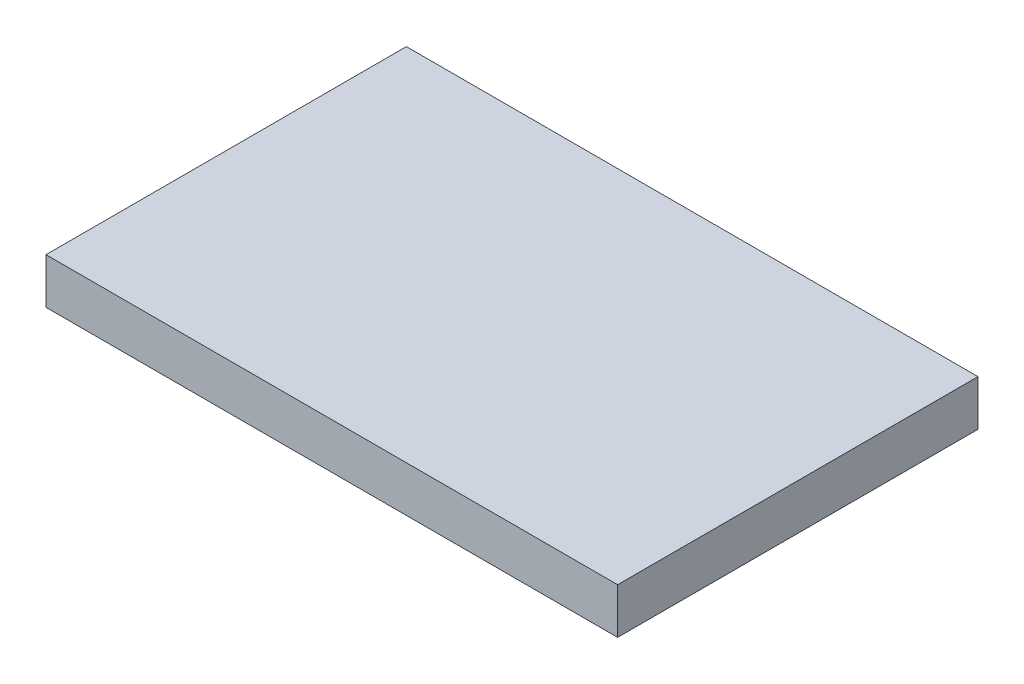
ISO-10303-21;
HEADER;
FILE_DESCRIPTION(('STEP AP214'),'2;1');
FILE_NAME('part.step','',(''),(''),'','','');
FILE_SCHEMA(('AUTOMOTIVE_DESIGN { 1 0 10303 214 1 1 1 1 }'));
ENDSEC;
DATA;
#1=APPLICATION_CONTEXT('core data for automotive mechanical design processes');
#2=APPLICATION_PROTOCOL_DEFINITION('international standard','automotive_design',2000,#1);
#3=PRODUCT_CONTEXT('',#1,'mechanical');
#4=PRODUCT('Part','Part','',(#3));
#5=PRODUCT_RELATED_PRODUCT_CATEGORY('part','',(#4));
#6=PRODUCT_DEFINITION_FORMATION('','',#4);
#7=PRODUCT_DEFINITION_CONTEXT('part definition',#1,'design');
#8=PRODUCT_DEFINITION('design','',#6,#7);
#9=PRODUCT_DEFINITION_SHAPE('','',#8);
#10=(LENGTH_UNIT() NAMED_UNIT(*) SI_UNIT(.MILLI.,.METRE.));
#11=(NAMED_UNIT(*) PLANE_ANGLE_UNIT() SI_UNIT($,.RADIAN.));
#12=(NAMED_UNIT(*) SI_UNIT($,.STERADIAN.) SOLID_ANGLE_UNIT());
#13=UNCERTAINTY_MEASURE_WITH_UNIT(LENGTH_MEASURE(1.E-05),#10,'distance_accuracy_value','');
#14=(GEOMETRIC_REPRESENTATION_CONTEXT(3) GLOBAL_UNCERTAINTY_ASSIGNED_CONTEXT((#13)) GLOBAL_UNIT_ASSIGNED_CONTEXT((#10,
#11,#12)) REPRESENTATION_CONTEXT('',''));
#15=CARTESIAN_POINT('',(0.,0.,0.));
#16=DIRECTION('',(0.,0.,1.));
#17=DIRECTION('',(1.,0.,0.));
#18=AXIS2_PLACEMENT_3D('',#15,#16,#17);
#19=CARTESIAN_POINT('',(-6.07499999999999,0.97,3.82999999999999));
#20=DIRECTION('',(1.,0.,0.));
#21=DIRECTION('',(0.,0.,-1.));
#22=AXIS2_PLACEMENT_3D('',#19,#20,#21);
#23=PLANE('',#22);
#24=DIRECTION('',(0.,0.,1.));
#25=VECTOR('',#24,1.);
#26=CARTESIAN_POINT('',(-6.07499999999999,0.,3.82999999999999));
#27=LINE('',#26,#25);
#28=CARTESIAN_POINT('',(-6.07499999999999,0.,-3.83000000000001));
#29=VERTEX_POINT('',#28);
#30=CARTESIAN_POINT('',(-6.07499999999999,0.,3.82999999999999));
#31=VERTEX_POINT('',#30);
#32=EDGE_CURVE('E99',#29,#31,#27,.T.);
#33=ORIENTED_EDGE('',*,*,#32,.T.);
#34=DIRECTION('',(0.,-1.,0.));
#35=VECTOR('',#34,1.);
#36=CARTESIAN_POINT('',(-6.07499999999999,0.97,3.82999999999999));
#37=LINE('',#36,#35);
#38=CARTESIAN_POINT('',(-6.07499999999999,0.97,3.82999999999999));
#39=VERTEX_POINT('',#38);
#40=EDGE_CURVE('E11',#39,#31,#37,.T.);
#41=ORIENTED_EDGE('',*,*,#40,.F.);
#42=DIRECTION('',(0.,0.,1.));
#43=VECTOR('',#42,1.);
#44=CARTESIAN_POINT('',(-6.07499999999999,0.97,3.82999999999999));
#45=LINE('',#44,#43);
#46=CARTESIAN_POINT('',(-6.07499999999999,0.97,-3.83000000000001));
#47=VERTEX_POINT('',#46);
#48=EDGE_CURVE('E87',#47,#39,#45,.T.);
#49=ORIENTED_EDGE('',*,*,#48,.F.);
#50=DIRECTION('',(0.,-1.,0.));
#51=VECTOR('',#50,1.);
#52=CARTESIAN_POINT('',(-6.07499999999999,0.97,-3.83000000000001));
#53=LINE('',#52,#51);
#54=EDGE_CURVE('E95',#47,#29,#53,.T.);
#55=ORIENTED_EDGE('',*,*,#54,.T.);
#56=EDGE_LOOP('',(#33,#41,#49,#55));
#57=FACE_BOUND('',#56,.T.);
#58=ADVANCED_FACE('F36',(#57),#23,.F.);
#59=CARTESIAN_POINT('',(6.07500000000001,0.97,3.82999999999999));
#60=DIRECTION('',(0.,0.,-1.));
#61=DIRECTION('',(-1.,0.,0.));
#62=AXIS2_PLACEMENT_3D('',#59,#60,#61);
#63=PLANE('',#62);
#64=DIRECTION('',(1.,0.,0.));
#65=VECTOR('',#64,1.);
#66=CARTESIAN_POINT('',(6.07500000000001,0.,3.82999999999999));
#67=LINE('',#66,#65);
#68=CARTESIAN_POINT('',(6.07500000000001,0.,3.82999999999999));
#69=VERTEX_POINT('',#68);
#70=EDGE_CURVE('E91',#31,#69,#67,.T.);
#71=ORIENTED_EDGE('',*,*,#70,.T.);
#72=DIRECTION('',(0.,-1.,0.));
#73=VECTOR('',#72,1.);
#74=CARTESIAN_POINT('',(6.07500000000001,0.97,3.82999999999999));
#75=LINE('',#74,#73);
#76=CARTESIAN_POINT('',(6.07500000000001,0.97,3.82999999999999));
#77=VERTEX_POINT('',#76);
#78=EDGE_CURVE('E44',#77,#69,#75,.T.);
#79=ORIENTED_EDGE('',*,*,#78,.F.);
#80=DIRECTION('',(1.,0.,0.));
#81=VECTOR('',#80,1.);
#82=CARTESIAN_POINT('',(6.07500000000001,0.97,3.82999999999999));
#83=LINE('',#82,#81);
#84=EDGE_CURVE('E82',#39,#77,#83,.T.);
#85=ORIENTED_EDGE('',*,*,#84,.F.);
#86=ORIENTED_EDGE('',*,*,#40,.T.);
#87=EDGE_LOOP('',(#71,#79,#85,#86));
#88=FACE_BOUND('',#87,.T.);
#89=ADVANCED_FACE('F90',(#88),#63,.F.);
#90=CARTESIAN_POINT('',(6.07500000000001,0.97,3.82999999999999));
#91=DIRECTION('',(-1.,0.,0.));
#92=DIRECTION('',(0.,0.,1.));
#93=AXIS2_PLACEMENT_3D('',#90,#91,#92);
#94=PLANE('',#93);
#95=DIRECTION('',(0.,0.,-1.));
#96=VECTOR('',#95,1.);
#97=CARTESIAN_POINT('',(6.07500000000001,0.,3.82999999999999));
#98=LINE('',#97,#96);
#99=CARTESIAN_POINT('',(6.07500000000001,0.,-3.83000000000001));
#100=VERTEX_POINT('',#99);
#101=EDGE_CURVE('E69',#69,#100,#98,.T.);
#102=ORIENTED_EDGE('',*,*,#101,.T.);
#103=DIRECTION('',(0.,-1.,0.));
#104=VECTOR('',#103,1.);
#105=CARTESIAN_POINT('',(6.07500000000001,0.97,-3.83000000000001));
#106=LINE('',#105,#104);
#107=CARTESIAN_POINT('',(6.07500000000001,0.97,-3.83000000000001));
#108=VERTEX_POINT('',#107);
#109=EDGE_CURVE('E92',#108,#100,#106,.T.);
#110=ORIENTED_EDGE('',*,*,#109,.F.);
#111=DIRECTION('',(0.,0.,-1.));
#112=VECTOR('',#111,1.);
#113=CARTESIAN_POINT('',(6.07500000000001,0.97,3.82999999999999));
#114=LINE('',#113,#112);
#115=EDGE_CURVE('E85',#77,#108,#114,.T.);
#116=ORIENTED_EDGE('',*,*,#115,.F.);
#117=ORIENTED_EDGE('',*,*,#78,.T.);
#118=EDGE_LOOP('',(#102,#110,#116,#117));
#119=FACE_BOUND('',#118,.T.);
#120=ADVANCED_FACE('F93',(#119),#94,.F.);
#121=CARTESIAN_POINT('',(6.07500000000001,0.97,-3.83000000000001));
#122=DIRECTION('',(0.,0.,1.));
#123=DIRECTION('',(1.,0.,0.));
#124=AXIS2_PLACEMENT_3D('',#121,#122,#123);
#125=PLANE('',#124);
#126=DIRECTION('',(-1.,0.,0.));
#127=VECTOR('',#126,1.);
#128=CARTESIAN_POINT('',(6.07500000000001,0.,-3.83000000000001));
#129=LINE('',#128,#127);
#130=EDGE_CURVE('E75',#100,#29,#129,.T.);
#131=ORIENTED_EDGE('',*,*,#130,.T.);
#132=ORIENTED_EDGE('',*,*,#54,.F.);
#133=DIRECTION('',(-1.,0.,0.));
#134=VECTOR('',#133,1.);
#135=CARTESIAN_POINT('',(6.07500000000001,0.97,-3.83000000000001));
#136=LINE('',#135,#134);
#137=EDGE_CURVE('E52',#108,#47,#136,.T.);
#138=ORIENTED_EDGE('',*,*,#137,.F.);
#139=ORIENTED_EDGE('',*,*,#109,.T.);
#140=EDGE_LOOP('',(#131,#132,#138,#139));
#141=FACE_BOUND('',#140,.T.);
#142=ADVANCED_FACE('F106',(#141),#125,.F.);
#143=CARTESIAN_POINT('',(0.,0.97,0.));
#144=DIRECTION('',(0.,1.,0.));
#145=DIRECTION('',(0.,0.,1.));
#146=AXIS2_PLACEMENT_3D('',#143,#144,#145);
#147=PLANE('',#146);
#148=ORIENTED_EDGE('',*,*,#48,.T.);
#149=ORIENTED_EDGE('',*,*,#84,.T.);
#150=ORIENTED_EDGE('',*,*,#115,.T.);
#151=ORIENTED_EDGE('',*,*,#137,.T.);
#152=EDGE_LOOP('',(#148,#149,#150,#151));
#153=FACE_BOUND('',#152,.T.);
#154=ADVANCED_FACE('F83',(#153),#147,.T.);
#155=CARTESIAN_POINT('',(0.,0.,0.));
#156=DIRECTION('',(0.,1.,0.));
#157=DIRECTION('',(0.,0.,1.));
#158=AXIS2_PLACEMENT_3D('',#155,#156,#157);
#159=PLANE('',#158);
#160=ORIENTED_EDGE('',*,*,#32,.F.);
#161=ORIENTED_EDGE('',*,*,#130,.F.);
#162=ORIENTED_EDGE('',*,*,#101,.F.);
#163=ORIENTED_EDGE('',*,*,#70,.F.);
#164=EDGE_LOOP('',(#160,#161,#162,#163));
#165=FACE_BOUND('',#164,.T.);
#166=ADVANCED_FACE('F109',(#165),#159,.F.);
#167=CLOSED_SHELL('',(#58,#89,#120,#142,#154,#166));
#168=MANIFOLD_SOLID_BREP('B2',#167);
#169=ADVANCED_BREP_SHAPE_REPRESENTATION('',(#18,#168),#14);
#170=SHAPE_DEFINITION_REPRESENTATION(#9,#169);
ENDSEC;
END-ISO-10303-21;
